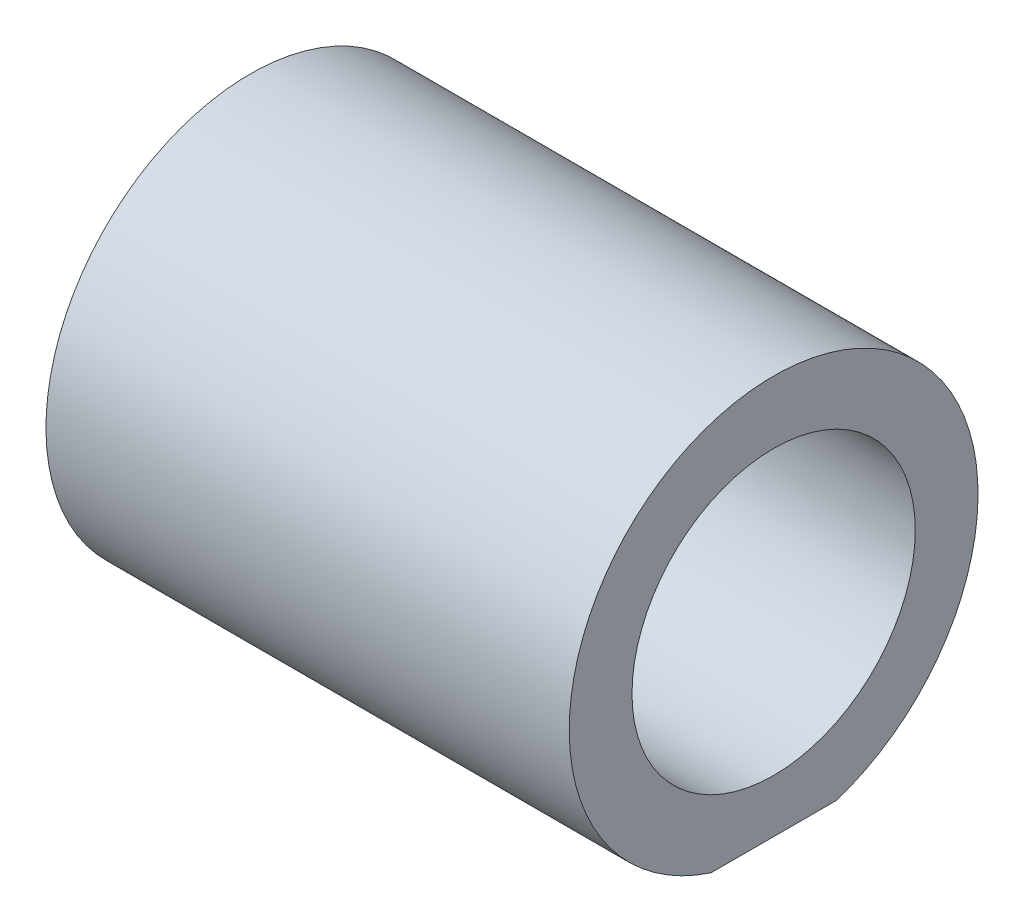
ISO-10303-21;
HEADER;
FILE_DESCRIPTION(('STEP AP214'),'2;1');
FILE_NAME('part.step','',(''),(''),'','','');
FILE_SCHEMA(('AUTOMOTIVE_DESIGN { 1 0 10303 214 1 1 1 1 }'));
ENDSEC;
DATA;
#1=APPLICATION_CONTEXT('core data for automotive mechanical design processes');
#2=APPLICATION_PROTOCOL_DEFINITION('international standard','automotive_design',2000,#1);
#3=PRODUCT_CONTEXT('',#1,'mechanical');
#4=PRODUCT('Part','Part','',(#3));
#5=PRODUCT_RELATED_PRODUCT_CATEGORY('part','',(#4));
#6=PRODUCT_DEFINITION_FORMATION('','',#4);
#7=PRODUCT_DEFINITION_CONTEXT('part definition',#1,'design');
#8=PRODUCT_DEFINITION('design','',#6,#7);
#9=PRODUCT_DEFINITION_SHAPE('','',#8);
#10=(LENGTH_UNIT() NAMED_UNIT(*) SI_UNIT(.MILLI.,.METRE.));
#11=(NAMED_UNIT(*) PLANE_ANGLE_UNIT() SI_UNIT($,.RADIAN.));
#12=(NAMED_UNIT(*) SI_UNIT($,.STERADIAN.) SOLID_ANGLE_UNIT());
#13=UNCERTAINTY_MEASURE_WITH_UNIT(LENGTH_MEASURE(1.E-05),#10,'distance_accuracy_value','');
#14=(GEOMETRIC_REPRESENTATION_CONTEXT(3) GLOBAL_UNCERTAINTY_ASSIGNED_CONTEXT((#13)) GLOBAL_UNIT_ASSIGNED_CONTEXT((#10,
#11,#12)) REPRESENTATION_CONTEXT('',''));
#15=CARTESIAN_POINT('',(0.,0.,0.));
#16=DIRECTION('',(0.,0.,1.));
#17=DIRECTION('',(1.,0.,0.));
#18=AXIS2_PLACEMENT_3D('',#15,#16,#17);
#19=CARTESIAN_POINT('',(20.32,0.,0.));
#20=DIRECTION('',(-1.,0.,0.));
#21=DIRECTION('',(0.,0.,1.));
#22=AXIS2_PLACEMENT_3D('',#19,#20,#21);
#23=PLANE('',#22);
#24=CARTESIAN_POINT('',(20.32,0.,0.));
#25=DIRECTION('',(1.,0.,0.));
#26=DIRECTION('',(0.,0.,1.));
#27=AXIS2_PLACEMENT_3D('',#24,#25,#26);
#28=CIRCLE('',#27,7.9375);
#29=CARTESIAN_POINT('',(20.32,-7.5565,-2.42965306165304));
#30=VERTEX_POINT('',#29);
#31=CARTESIAN_POINT('',(20.32,-7.5565,2.42965306165304));
#32=VERTEX_POINT('',#31);
#33=EDGE_CURVE('E78',#30,#32,#28,.T.);
#34=ORIENTED_EDGE('',*,*,#33,.T.);
#35=DIRECTION('',(0.,0.,-1.));
#36=VECTOR('',#35,1.);
#37=CARTESIAN_POINT('',(20.32,-7.5565,-2.42965306165304));
#38=LINE('',#37,#36);
#39=EDGE_CURVE('E62',#32,#30,#38,.T.);
#40=ORIENTED_EDGE('',*,*,#39,.T.);
#41=EDGE_LOOP('',(#34,#40));
#42=FACE_BOUND('',#41,.T.);
#43=CARTESIAN_POINT('',(20.32,0.,0.));
#44=DIRECTION('',(1.,0.,0.));
#45=DIRECTION('',(0.,0.,-1.));
#46=AXIS2_PLACEMENT_3D('',#43,#44,#45);
#47=CIRCLE('',#46,5.500000049);
#48=CARTESIAN_POINT('',(20.32,0.,-5.500000049));
#49=VERTEX_POINT('',#48);
#50=EDGE_CURVE('E86',#49,#49,#47,.T.);
#51=ORIENTED_EDGE('',*,*,#50,.F.);
#52=EDGE_LOOP('',(#51));
#53=FACE_BOUND('',#52,.T.);
#54=ADVANCED_FACE('F45',(#42,#53),#23,.F.);
#55=CARTESIAN_POINT('',(0.,0.,0.));
#56=DIRECTION('',(-1.,0.,0.));
#57=DIRECTION('',(0.,0.,1.));
#58=AXIS2_PLACEMENT_3D('',#55,#56,#57);
#59=PLANE('',#58);
#60=CARTESIAN_POINT('',(0.,0.,0.));
#61=DIRECTION('',(1.,0.,0.));
#62=DIRECTION('',(0.,0.,1.));
#63=AXIS2_PLACEMENT_3D('',#60,#61,#62);
#64=CIRCLE('',#63,7.9375);
#65=CARTESIAN_POINT('',(0.,-7.5565,-2.42965306165304));
#66=VERTEX_POINT('',#65);
#67=CARTESIAN_POINT('',(0.,-7.5565,2.42965306165304));
#68=VERTEX_POINT('',#67);
#69=EDGE_CURVE('E79',#66,#68,#64,.T.);
#70=ORIENTED_EDGE('',*,*,#69,.F.);
#71=DIRECTION('',(0.,0.,-1.));
#72=VECTOR('',#71,1.);
#73=CARTESIAN_POINT('',(0.,-7.5565,-2.42965306165304));
#74=LINE('',#73,#72);
#75=EDGE_CURVE('E70',#68,#66,#74,.T.);
#76=ORIENTED_EDGE('',*,*,#75,.F.);
#77=EDGE_LOOP('',(#70,#76));
#78=FACE_BOUND('',#77,.T.);
#79=CARTESIAN_POINT('',(0.,0.,0.));
#80=DIRECTION('',(1.,0.,0.));
#81=DIRECTION('',(0.,0.,-1.));
#82=AXIS2_PLACEMENT_3D('',#79,#80,#81);
#83=CIRCLE('',#82,5.500000049);
#84=CARTESIAN_POINT('',(0.,0.,-5.500000049));
#85=VERTEX_POINT('',#84);
#86=EDGE_CURVE('E90',#85,#85,#83,.T.);
#87=ORIENTED_EDGE('',*,*,#86,.T.);
#88=EDGE_LOOP('',(#87));
#89=FACE_BOUND('',#88,.T.);
#90=ADVANCED_FACE('F83',(#78,#89),#59,.T.);
#91=CARTESIAN_POINT('',(20.32,0.,0.));
#92=DIRECTION('',(-1.,0.,0.));
#93=DIRECTION('',(0.,0.,1.));
#94=AXIS2_PLACEMENT_3D('',#91,#92,#93);
#95=CYLINDRICAL_SURFACE('',#94,7.9375);
#96=ORIENTED_EDGE('',*,*,#69,.T.);
#97=DIRECTION('',(-1.,0.,0.));
#98=VECTOR('',#97,1.);
#99=CARTESIAN_POINT('',(20.32,-7.5565,2.42965306165304));
#100=LINE('',#99,#98);
#101=EDGE_CURVE('E11',#32,#68,#100,.T.);
#102=ORIENTED_EDGE('',*,*,#101,.F.);
#103=ORIENTED_EDGE('',*,*,#33,.F.);
#104=DIRECTION('',(-1.,0.,0.));
#105=VECTOR('',#104,1.);
#106=CARTESIAN_POINT('',(20.32,-7.5565,-2.42965306165304));
#107=LINE('',#106,#105);
#108=EDGE_CURVE('E55',#30,#66,#107,.T.);
#109=ORIENTED_EDGE('',*,*,#108,.T.);
#110=EDGE_LOOP('',(#96,#102,#103,#109));
#111=FACE_BOUND('',#110,.T.);
#112=ADVANCED_FACE('F47',(#111),#95,.T.);
#113=CARTESIAN_POINT('',(20.32,-7.5565,-2.42965306165304));
#114=DIRECTION('',(0.,1.,0.));
#115=DIRECTION('',(0.,0.,1.));
#116=AXIS2_PLACEMENT_3D('',#113,#114,#115);
#117=PLANE('',#116);
#118=ORIENTED_EDGE('',*,*,#75,.T.);
#119=ORIENTED_EDGE('',*,*,#108,.F.);
#120=ORIENTED_EDGE('',*,*,#39,.F.);
#121=ORIENTED_EDGE('',*,*,#101,.T.);
#122=EDGE_LOOP('',(#118,#119,#120,#121));
#123=FACE_BOUND('',#122,.T.);
#124=ADVANCED_FACE('F73',(#123),#117,.F.);
#125=CARTESIAN_POINT('',(20.32,0.,0.));
#126=DIRECTION('',(-1.,0.,0.));
#127=DIRECTION('',(0.,0.,1.));
#128=AXIS2_PLACEMENT_3D('',#125,#126,#127);
#129=CYLINDRICAL_SURFACE('',#128,5.500000049);
#130=ORIENTED_EDGE('',*,*,#50,.T.);
#131=EDGE_LOOP('',(#130));
#132=FACE_BOUND('',#131,.T.);
#133=ORIENTED_EDGE('',*,*,#86,.F.);
#134=EDGE_LOOP('',(#133));
#135=FACE_BOUND('',#134,.T.);
#136=ADVANCED_FACE('F101',(#132,#135),#129,.F.);
#137=CLOSED_SHELL('',(#54,#90,#112,#124,#136));
#138=MANIFOLD_SOLID_BREP('B2',#137);
#139=ADVANCED_BREP_SHAPE_REPRESENTATION('',(#18,#138),#14);
#140=SHAPE_DEFINITION_REPRESENTATION(#9,#139);
ENDSEC;
END-ISO-10303-21;
